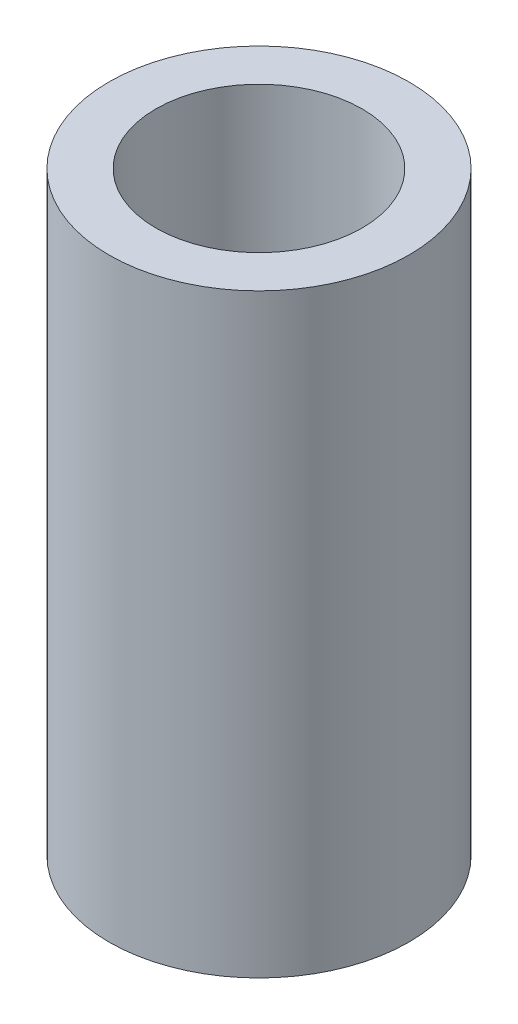
ISO-10303-21;
HEADER;
FILE_DESCRIPTION(('STEP AP214'),'2;1');
FILE_NAME('part.step','',(''),(''),'','','');
FILE_SCHEMA(('AUTOMOTIVE_DESIGN { 1 0 10303 214 1 1 1 1 }'));
ENDSEC;
DATA;
#1=APPLICATION_CONTEXT('core data for automotive mechanical design processes');
#2=APPLICATION_PROTOCOL_DEFINITION('international standard','automotive_design',2000,#1);
#3=PRODUCT_CONTEXT('',#1,'mechanical');
#4=PRODUCT('Part','Part','',(#3));
#5=PRODUCT_RELATED_PRODUCT_CATEGORY('part','',(#4));
#6=PRODUCT_DEFINITION_FORMATION('','',#4);
#7=PRODUCT_DEFINITION_CONTEXT('part definition',#1,'design');
#8=PRODUCT_DEFINITION('design','',#6,#7);
#9=PRODUCT_DEFINITION_SHAPE('','',#8);
#10=(LENGTH_UNIT() NAMED_UNIT(*) SI_UNIT(.MILLI.,.METRE.));
#11=(NAMED_UNIT(*) PLANE_ANGLE_UNIT() SI_UNIT($,.RADIAN.));
#12=(NAMED_UNIT(*) SI_UNIT($,.STERADIAN.) SOLID_ANGLE_UNIT());
#13=UNCERTAINTY_MEASURE_WITH_UNIT(LENGTH_MEASURE(1.E-05),#10,'distance_accuracy_value','');
#14=(GEOMETRIC_REPRESENTATION_CONTEXT(3) GLOBAL_UNCERTAINTY_ASSIGNED_CONTEXT((#13)) GLOBAL_UNIT_ASSIGNED_CONTEXT((#10,
#11,#12)) REPRESENTATION_CONTEXT('',''));
#15=CARTESIAN_POINT('',(0.,0.,0.));
#16=DIRECTION('',(0.,0.,1.));
#17=DIRECTION('',(1.,0.,0.));
#18=AXIS2_PLACEMENT_3D('',#15,#16,#17);
#19=CARTESIAN_POINT('',(0.,15.748,0.));
#20=DIRECTION('',(0.,-1.,0.));
#21=DIRECTION('',(0.,0.,-1.));
#22=AXIS2_PLACEMENT_3D('',#19,#20,#21);
#23=CYLINDRICAL_SURFACE('',#22,2.7305);
#24=CARTESIAN_POINT('',(0.,0.,0.));
#25=DIRECTION('',(0.,-1.,0.));
#26=DIRECTION('',(0.,0.,-1.));
#27=AXIS2_PLACEMENT_3D('',#24,#25,#26);
#28=CIRCLE('',#27,2.7305);
#29=CARTESIAN_POINT('',(0.,0.,-2.7305));
#30=VERTEX_POINT('',#29);
#31=EDGE_CURVE('E27',#30,#30,#28,.T.);
#32=ORIENTED_EDGE('',*,*,#31,.T.);
#33=EDGE_LOOP('',(#32));
#34=FACE_BOUND('',#33,.T.);
#35=CARTESIAN_POINT('',(0.,15.748,0.));
#36=DIRECTION('',(0.,-1.,0.));
#37=DIRECTION('',(0.,0.,-1.));
#38=AXIS2_PLACEMENT_3D('',#35,#36,#37);
#39=CIRCLE('',#38,2.7305);
#40=CARTESIAN_POINT('',(0.,15.748,-2.7305));
#41=VERTEX_POINT('',#40);
#42=EDGE_CURVE('E18',#41,#41,#39,.T.);
#43=ORIENTED_EDGE('',*,*,#42,.F.);
#44=EDGE_LOOP('',(#43));
#45=FACE_BOUND('',#44,.T.);
#46=ADVANCED_FACE('F15',(#34,#45),#23,.F.);
#47=CARTESIAN_POINT('',(0.,15.748,0.));
#48=DIRECTION('',(0.,1.,0.));
#49=DIRECTION('',(0.,0.,1.));
#50=AXIS2_PLACEMENT_3D('',#47,#48,#49);
#51=PLANE('',#50);
#52=ORIENTED_EDGE('',*,*,#42,.T.);
#53=EDGE_LOOP('',(#52));
#54=FACE_BOUND('',#53,.T.);
#55=CARTESIAN_POINT('',(0.,15.748,0.));
#56=DIRECTION('',(0.,-1.,0.));
#57=DIRECTION('',(0.,0.,-1.));
#58=AXIS2_PLACEMENT_3D('',#55,#56,#57);
#59=CIRCLE('',#58,3.96875);
#60=CARTESIAN_POINT('',(0.,15.748,-3.96875));
#61=VERTEX_POINT('',#60);
#62=EDGE_CURVE('E22',#61,#61,#59,.T.);
#63=ORIENTED_EDGE('',*,*,#62,.F.);
#64=EDGE_LOOP('',(#63));
#65=FACE_BOUND('',#64,.T.);
#66=ADVANCED_FACE('F35',(#54,#65),#51,.T.);
#67=CARTESIAN_POINT('',(0.,0.,0.));
#68=DIRECTION('',(0.,1.,0.));
#69=DIRECTION('',(0.,0.,1.));
#70=AXIS2_PLACEMENT_3D('',#67,#68,#69);
#71=PLANE('',#70);
#72=ORIENTED_EDGE('',*,*,#31,.F.);
#73=EDGE_LOOP('',(#72));
#74=FACE_BOUND('',#73,.T.);
#75=CARTESIAN_POINT('',(0.,0.,0.));
#76=DIRECTION('',(0.,-1.,0.));
#77=DIRECTION('',(0.,0.,-1.));
#78=AXIS2_PLACEMENT_3D('',#75,#76,#77);
#79=CIRCLE('',#78,3.96875);
#80=CARTESIAN_POINT('',(0.,0.,-3.96875));
#81=VERTEX_POINT('',#80);
#82=EDGE_CURVE('E10',#81,#81,#79,.F.);
#83=ORIENTED_EDGE('',*,*,#82,.F.);
#84=EDGE_LOOP('',(#83));
#85=FACE_BOUND('',#84,.T.);
#86=ADVANCED_FACE('F43',(#74,#85),#71,.F.);
#87=CARTESIAN_POINT('',(0.,15.748,0.));
#88=DIRECTION('',(0.,-1.,0.));
#89=DIRECTION('',(0.,0.,-1.));
#90=AXIS2_PLACEMENT_3D('',#87,#88,#89);
#91=CYLINDRICAL_SURFACE('',#90,3.96875);
#92=ORIENTED_EDGE('',*,*,#82,.T.);
#93=EDGE_LOOP('',(#92));
#94=FACE_BOUND('',#93,.T.);
#95=ORIENTED_EDGE('',*,*,#62,.T.);
#96=EDGE_LOOP('',(#95));
#97=FACE_BOUND('',#96,.T.);
#98=ADVANCED_FACE('F44',(#94,#97),#91,.T.);
#99=CLOSED_SHELL('',(#46,#66,#86,#98));
#100=MANIFOLD_SOLID_BREP('B1',#99);
#101=ADVANCED_BREP_SHAPE_REPRESENTATION('',(#18,#100),#14);
#102=SHAPE_DEFINITION_REPRESENTATION(#9,#101);
ENDSEC;
END-ISO-10303-21;
